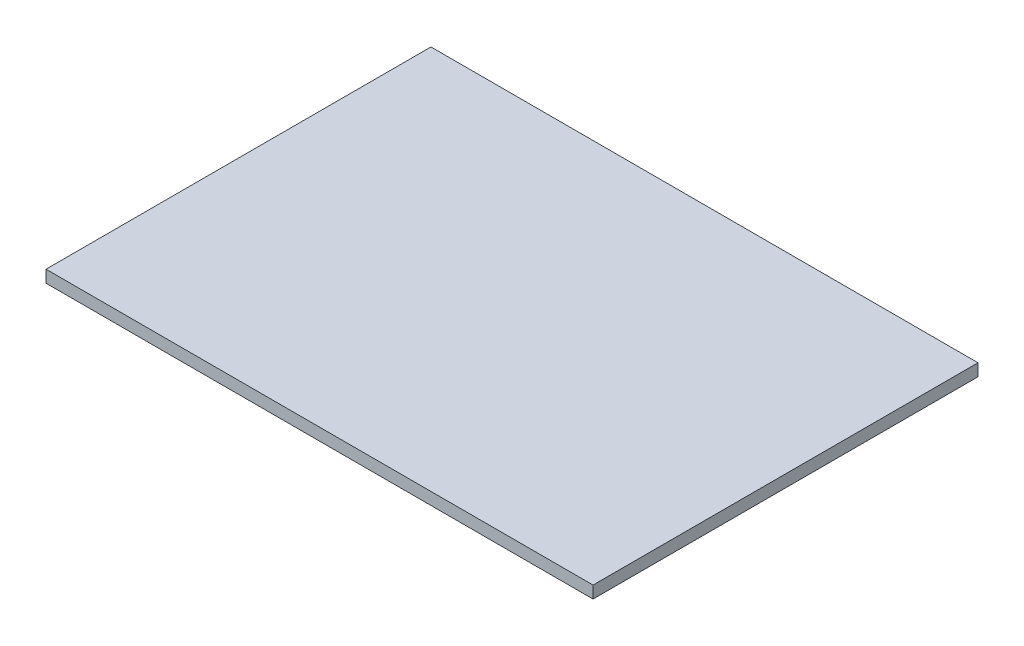
ISO-10303-21;
HEADER;
FILE_DESCRIPTION(('STEP AP214'),'2;1');
FILE_NAME('part.step','',(''),(''),'','','');
FILE_SCHEMA(('AUTOMOTIVE_DESIGN { 1 0 10303 214 1 1 1 1 }'));
ENDSEC;
DATA;
#1=APPLICATION_CONTEXT('core data for automotive mechanical design processes');
#2=APPLICATION_PROTOCOL_DEFINITION('international standard','automotive_design',2000,#1);
#3=PRODUCT_CONTEXT('',#1,'mechanical');
#4=PRODUCT('Part','Part','',(#3));
#5=PRODUCT_RELATED_PRODUCT_CATEGORY('part','',(#4));
#6=PRODUCT_DEFINITION_FORMATION('','',#4);
#7=PRODUCT_DEFINITION_CONTEXT('part definition',#1,'design');
#8=PRODUCT_DEFINITION('design','',#6,#7);
#9=PRODUCT_DEFINITION_SHAPE('','',#8);
#10=(LENGTH_UNIT() NAMED_UNIT(*) SI_UNIT(.MILLI.,.METRE.));
#11=(NAMED_UNIT(*) PLANE_ANGLE_UNIT() SI_UNIT($,.RADIAN.));
#12=(NAMED_UNIT(*) SI_UNIT($,.STERADIAN.) SOLID_ANGLE_UNIT());
#13=UNCERTAINTY_MEASURE_WITH_UNIT(LENGTH_MEASURE(1.E-05),#10,'distance_accuracy_value','');
#14=(GEOMETRIC_REPRESENTATION_CONTEXT(3) GLOBAL_UNCERTAINTY_ASSIGNED_CONTEXT((#13)) GLOBAL_UNIT_ASSIGNED_CONTEXT((#10,
#11,#12)) REPRESENTATION_CONTEXT('',''));
#15=CARTESIAN_POINT('',(0.,0.,0.));
#16=DIRECTION('',(0.,0.,1.));
#17=DIRECTION('',(1.,0.,0.));
#18=AXIS2_PLACEMENT_3D('',#15,#16,#17);
#19=CARTESIAN_POINT('',(-67.5,3.,47.5));
#20=DIRECTION('',(1.,0.,0.));
#21=DIRECTION('',(0.,0.,-1.));
#22=AXIS2_PLACEMENT_3D('',#19,#20,#21);
#23=PLANE('',#22);
#24=DIRECTION('',(0.,0.,1.));
#25=VECTOR('',#24,1.);
#26=CARTESIAN_POINT('',(-67.5,0.,47.5));
#27=LINE('',#26,#25);
#28=CARTESIAN_POINT('',(-67.5,0.,-47.5));
#29=VERTEX_POINT('',#28);
#30=CARTESIAN_POINT('',(-67.5,0.,47.5));
#31=VERTEX_POINT('',#30);
#32=EDGE_CURVE('E96',#29,#31,#27,.T.);
#33=ORIENTED_EDGE('',*,*,#32,.T.);
#34=DIRECTION('',(0.,-1.,0.));
#35=VECTOR('',#34,1.);
#36=CARTESIAN_POINT('',(-67.5,3.,47.5));
#37=LINE('',#36,#35);
#38=CARTESIAN_POINT('',(-67.5,3.,47.5));
#39=VERTEX_POINT('',#38);
#40=EDGE_CURVE('E11',#39,#31,#37,.T.);
#41=ORIENTED_EDGE('',*,*,#40,.F.);
#42=DIRECTION('',(0.,0.,1.));
#43=VECTOR('',#42,1.);
#44=CARTESIAN_POINT('',(-67.5,3.,47.5));
#45=LINE('',#44,#43);
#46=CARTESIAN_POINT('',(-67.5,3.,-47.5));
#47=VERTEX_POINT('',#46);
#48=EDGE_CURVE('E84',#47,#39,#45,.T.);
#49=ORIENTED_EDGE('',*,*,#48,.F.);
#50=DIRECTION('',(0.,-1.,0.));
#51=VECTOR('',#50,1.);
#52=CARTESIAN_POINT('',(-67.5,3.,-47.5));
#53=LINE('',#52,#51);
#54=EDGE_CURVE('E92',#47,#29,#53,.T.);
#55=ORIENTED_EDGE('',*,*,#54,.T.);
#56=EDGE_LOOP('',(#33,#41,#49,#55));
#57=FACE_BOUND('',#56,.T.);
#58=ADVANCED_FACE('F33',(#57),#23,.F.);
#59=CARTESIAN_POINT('',(67.5,3.,47.5));
#60=DIRECTION('',(0.,0.,-1.));
#61=DIRECTION('',(-1.,0.,0.));
#62=AXIS2_PLACEMENT_3D('',#59,#60,#61);
#63=PLANE('',#62);
#64=DIRECTION('',(1.,0.,0.));
#65=VECTOR('',#64,1.);
#66=CARTESIAN_POINT('',(67.5,0.,47.5));
#67=LINE('',#66,#65);
#68=CARTESIAN_POINT('',(67.5,0.,47.5));
#69=VERTEX_POINT('',#68);
#70=EDGE_CURVE('E88',#31,#69,#67,.T.);
#71=ORIENTED_EDGE('',*,*,#70,.T.);
#72=DIRECTION('',(0.,-1.,0.));
#73=VECTOR('',#72,1.);
#74=CARTESIAN_POINT('',(67.5,3.,47.5));
#75=LINE('',#74,#73);
#76=CARTESIAN_POINT('',(67.5,3.,47.5));
#77=VERTEX_POINT('',#76);
#78=EDGE_CURVE('E41',#77,#69,#75,.T.);
#79=ORIENTED_EDGE('',*,*,#78,.F.);
#80=DIRECTION('',(1.,0.,0.));
#81=VECTOR('',#80,1.);
#82=CARTESIAN_POINT('',(67.5,3.,47.5));
#83=LINE('',#82,#81);
#84=EDGE_CURVE('E79',#39,#77,#83,.T.);
#85=ORIENTED_EDGE('',*,*,#84,.F.);
#86=ORIENTED_EDGE('',*,*,#40,.T.);
#87=EDGE_LOOP('',(#71,#79,#85,#86));
#88=FACE_BOUND('',#87,.T.);
#89=ADVANCED_FACE('F87',(#88),#63,.F.);
#90=CARTESIAN_POINT('',(67.5,3.,47.5));
#91=DIRECTION('',(-1.,0.,0.));
#92=DIRECTION('',(0.,0.,1.));
#93=AXIS2_PLACEMENT_3D('',#90,#91,#92);
#94=PLANE('',#93);
#95=DIRECTION('',(0.,0.,-1.));
#96=VECTOR('',#95,1.);
#97=CARTESIAN_POINT('',(67.5,0.,47.5));
#98=LINE('',#97,#96);
#99=CARTESIAN_POINT('',(67.5,0.,-47.5));
#100=VERTEX_POINT('',#99);
#101=EDGE_CURVE('E66',#69,#100,#98,.T.);
#102=ORIENTED_EDGE('',*,*,#101,.T.);
#103=DIRECTION('',(0.,-1.,0.));
#104=VECTOR('',#103,1.);
#105=CARTESIAN_POINT('',(67.5,3.,-47.5));
#106=LINE('',#105,#104);
#107=CARTESIAN_POINT('',(67.5,3.,-47.5));
#108=VERTEX_POINT('',#107);
#109=EDGE_CURVE('E89',#108,#100,#106,.T.);
#110=ORIENTED_EDGE('',*,*,#109,.F.);
#111=DIRECTION('',(0.,0.,-1.));
#112=VECTOR('',#111,1.);
#113=CARTESIAN_POINT('',(67.5,3.,47.5));
#114=LINE('',#113,#112);
#115=EDGE_CURVE('E82',#77,#108,#114,.T.);
#116=ORIENTED_EDGE('',*,*,#115,.F.);
#117=ORIENTED_EDGE('',*,*,#78,.T.);
#118=EDGE_LOOP('',(#102,#110,#116,#117));
#119=FACE_BOUND('',#118,.T.);
#120=ADVANCED_FACE('F90',(#119),#94,.F.);
#121=CARTESIAN_POINT('',(67.5,3.,-47.5));
#122=DIRECTION('',(0.,0.,1.));
#123=DIRECTION('',(1.,0.,0.));
#124=AXIS2_PLACEMENT_3D('',#121,#122,#123);
#125=PLANE('',#124);
#126=DIRECTION('',(-1.,0.,0.));
#127=VECTOR('',#126,1.);
#128=CARTESIAN_POINT('',(67.5,0.,-47.5));
#129=LINE('',#128,#127);
#130=EDGE_CURVE('E72',#100,#29,#129,.T.);
#131=ORIENTED_EDGE('',*,*,#130,.T.);
#132=ORIENTED_EDGE('',*,*,#54,.F.);
#133=DIRECTION('',(-1.,0.,0.));
#134=VECTOR('',#133,1.);
#135=CARTESIAN_POINT('',(67.5,3.,-47.5));
#136=LINE('',#135,#134);
#137=EDGE_CURVE('E49',#108,#47,#136,.T.);
#138=ORIENTED_EDGE('',*,*,#137,.F.);
#139=ORIENTED_EDGE('',*,*,#109,.T.);
#140=EDGE_LOOP('',(#131,#132,#138,#139));
#141=FACE_BOUND('',#140,.T.);
#142=ADVANCED_FACE('F103',(#141),#125,.F.);
#143=CARTESIAN_POINT('',(0.,3.,0.));
#144=DIRECTION('',(0.,1.,0.));
#145=DIRECTION('',(0.,0.,1.));
#146=AXIS2_PLACEMENT_3D('',#143,#144,#145);
#147=PLANE('',#146);
#148=ORIENTED_EDGE('',*,*,#48,.T.);
#149=ORIENTED_EDGE('',*,*,#84,.T.);
#150=ORIENTED_EDGE('',*,*,#115,.T.);
#151=ORIENTED_EDGE('',*,*,#137,.T.);
#152=EDGE_LOOP('',(#148,#149,#150,#151));
#153=FACE_BOUND('',#152,.T.);
#154=ADVANCED_FACE('F80',(#153),#147,.T.);
#155=CARTESIAN_POINT('',(0.,0.,0.));
#156=DIRECTION('',(0.,1.,0.));
#157=DIRECTION('',(0.,0.,1.));
#158=AXIS2_PLACEMENT_3D('',#155,#156,#157);
#159=PLANE('',#158);
#160=ORIENTED_EDGE('',*,*,#32,.F.);
#161=ORIENTED_EDGE('',*,*,#130,.F.);
#162=ORIENTED_EDGE('',*,*,#101,.F.);
#163=ORIENTED_EDGE('',*,*,#70,.F.);
#164=EDGE_LOOP('',(#160,#161,#162,#163));
#165=FACE_BOUND('',#164,.T.);
#166=ADVANCED_FACE('F106',(#165),#159,.F.);
#167=CLOSED_SHELL('',(#58,#89,#120,#142,#154,#166));
#168=MANIFOLD_SOLID_BREP('B2',#167);
#169=ADVANCED_BREP_SHAPE_REPRESENTATION('',(#18,#168),#14);
#170=SHAPE_DEFINITION_REPRESENTATION(#9,#169);
ENDSEC;
END-ISO-10303-21;
